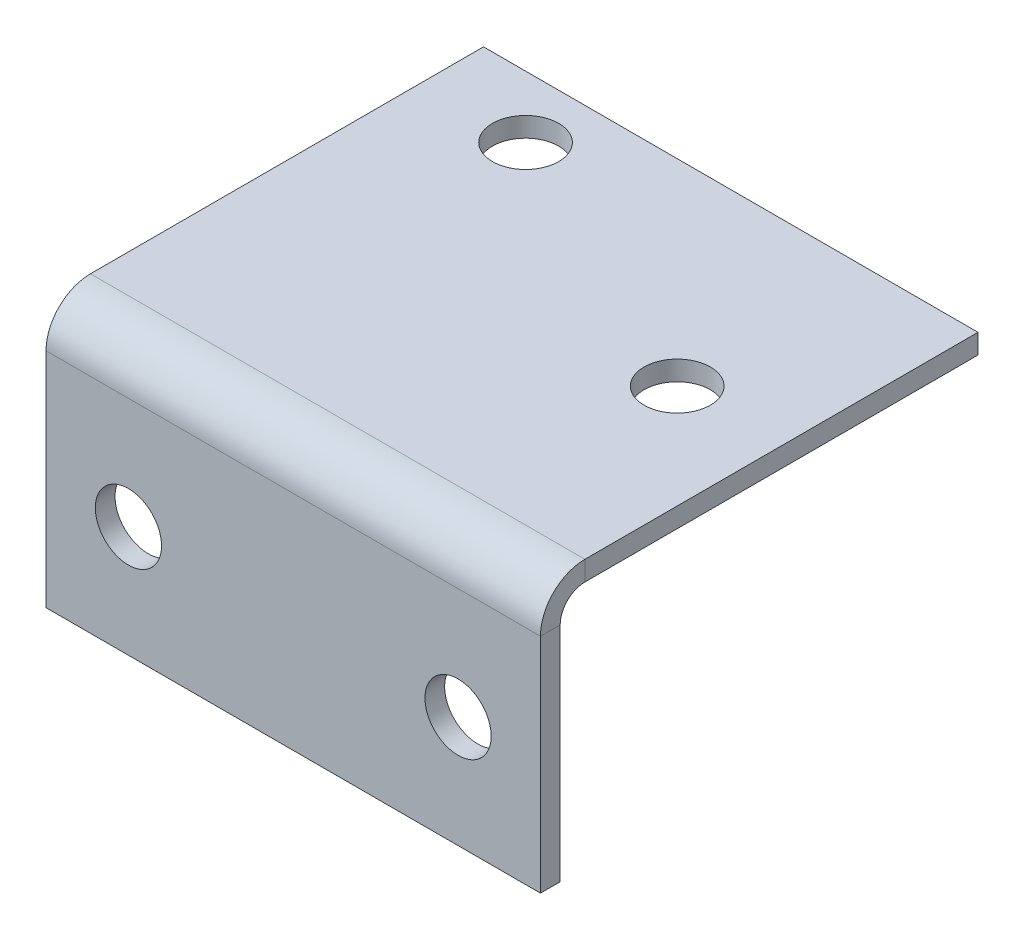
ISO-10303-21;
HEADER;
FILE_DESCRIPTION(('STEP AP214'),'2;1');
FILE_NAME('part.step','',(''),(''),'','','');
FILE_SCHEMA(('AUTOMOTIVE_DESIGN { 1 0 10303 214 1 1 1 1 }'));
ENDSEC;
DATA;
#1=APPLICATION_CONTEXT('core data for automotive mechanical design processes');
#2=APPLICATION_PROTOCOL_DEFINITION('international standard','automotive_design',2000,#1);
#3=PRODUCT_CONTEXT('',#1,'mechanical');
#4=PRODUCT('Part','Part','',(#3));
#5=PRODUCT_RELATED_PRODUCT_CATEGORY('part','',(#4));
#6=PRODUCT_DEFINITION_FORMATION('','',#4);
#7=PRODUCT_DEFINITION_CONTEXT('part definition',#1,'design');
#8=PRODUCT_DEFINITION('design','',#6,#7);
#9=PRODUCT_DEFINITION_SHAPE('','',#8);
#10=(LENGTH_UNIT() NAMED_UNIT(*) SI_UNIT(.MILLI.,.METRE.));
#11=(NAMED_UNIT(*) PLANE_ANGLE_UNIT() SI_UNIT($,.RADIAN.));
#12=(NAMED_UNIT(*) SI_UNIT($,.STERADIAN.) SOLID_ANGLE_UNIT());
#13=UNCERTAINTY_MEASURE_WITH_UNIT(LENGTH_MEASURE(1.E-05),#10,'distance_accuracy_value','');
#14=(GEOMETRIC_REPRESENTATION_CONTEXT(3) GLOBAL_UNCERTAINTY_ASSIGNED_CONTEXT((#13)) GLOBAL_UNIT_ASSIGNED_CONTEXT((#10,
#11,#12)) REPRESENTATION_CONTEXT('',''));
#15=CARTESIAN_POINT('',(0.,0.,0.));
#16=DIRECTION('',(0.,0.,1.));
#17=DIRECTION('',(1.,0.,0.));
#18=AXIS2_PLACEMENT_3D('',#15,#16,#17);
#19=CARTESIAN_POINT('',(19.05,9.52500000000001,-1.51892000000009));
#20=DIRECTION('',(1.,0.,0.));
#21=DIRECTION('',(0.,0.,-1.));
#22=AXIS2_PLACEMENT_3D('',#19,#20,#21);
#23=PLANE('',#22);
#24=DIRECTION('',(0.,1.,0.));
#25=VECTOR('',#24,1.);
#26=CARTESIAN_POINT('',(19.05,9.52500000000001,-1.51892000000009));
#27=LINE('',#26,#25);
#28=CARTESIAN_POINT('',(19.05,-9.525,-1.51892000000009));
#29=VERTEX_POINT('',#28);
#30=CARTESIAN_POINT('',(19.05,7.62000000000002,-1.51892000000009));
#31=VERTEX_POINT('',#30);
#32=EDGE_CURVE('E165',#29,#31,#27,.T.);
#33=ORIENTED_EDGE('',*,*,#32,.T.);
#34=DIRECTION('',(0.,0.,1.));
#35=VECTOR('',#34,1.);
#36=CARTESIAN_POINT('',(19.05,7.62000000000002,-1.51892000000009));
#37=LINE('',#36,#35);
#38=CARTESIAN_POINT('',(19.05,7.62000000000002,0.));
#39=VERTEX_POINT('',#38);
#40=EDGE_CURVE('E150',#31,#39,#37,.T.);
#41=ORIENTED_EDGE('',*,*,#40,.T.);
#42=DIRECTION('',(0.,1.,0.));
#43=VECTOR('',#42,1.);
#44=CARTESIAN_POINT('',(19.05,9.52500000000001,0.));
#45=LINE('',#44,#43);
#46=CARTESIAN_POINT('',(19.05,-9.525,0.));
#47=VERTEX_POINT('',#46);
#48=EDGE_CURVE('E162',#47,#39,#45,.T.);
#49=ORIENTED_EDGE('',*,*,#48,.F.);
#50=DIRECTION('',(0.,0.,1.));
#51=VECTOR('',#50,1.);
#52=CARTESIAN_POINT('',(19.05,-9.525,-1.51892000000009));
#53=LINE('',#52,#51);
#54=EDGE_CURVE('E13',#29,#47,#53,.T.);
#55=ORIENTED_EDGE('',*,*,#54,.F.);
#56=EDGE_LOOP('',(#33,#41,#49,#55));
#57=FACE_BOUND('',#56,.T.);
#58=ADVANCED_FACE('F52',(#57),#23,.T.);
#59=CARTESIAN_POINT('',(0.,0.,-1.51892000000009));
#60=DIRECTION('',(0.,0.,1.));
#61=DIRECTION('',(1.,0.,0.));
#62=AXIS2_PLACEMENT_3D('',#59,#60,#61);
#63=PLANE('',#62);
#64=CARTESIAN_POINT('',(-12.7,-0.952500000000009,-1.51892000000009));
#65=DIRECTION('',(0.,0.,1.));
#66=DIRECTION('',(1.,0.,0.));
#67=AXIS2_PLACEMENT_3D('',#64,#65,#66);
#68=CIRCLE('',#67,2.55269999999999);
#69=CARTESIAN_POINT('',(-10.1473,-0.952500000000009,-1.51892000000009));
#70=VERTEX_POINT('',#69);
#71=EDGE_CURVE('E224',#70,#70,#68,.T.);
#72=ORIENTED_EDGE('',*,*,#71,.T.);
#73=EDGE_LOOP('',(#72));
#74=FACE_BOUND('',#73,.T.);
#75=CARTESIAN_POINT('',(12.7,-0.952499999999995,-1.51892000000009));
#76=DIRECTION('',(0.,0.,1.));
#77=DIRECTION('',(1.,0.,0.));
#78=AXIS2_PLACEMENT_3D('',#75,#76,#77);
#79=CIRCLE('',#78,2.55269999999999);
#80=CARTESIAN_POINT('',(15.2527,-0.952499999999995,-1.51892000000009));
#81=VERTEX_POINT('',#80);
#82=EDGE_CURVE('E217',#81,#81,#79,.T.);
#83=ORIENTED_EDGE('',*,*,#82,.T.);
#84=EDGE_LOOP('',(#83));
#85=FACE_BOUND('',#84,.T.);
#86=DIRECTION('',(1.,0.,0.));
#87=VECTOR('',#86,1.);
#88=CARTESIAN_POINT('',(19.05,7.62000000000002,-1.51892000000009));
#89=LINE('',#88,#87);
#90=CARTESIAN_POINT('',(-19.05,7.62,-1.51892000000009));
#91=VERTEX_POINT('',#90);
#92=EDGE_CURVE('E156',#31,#91,#89,.F.);
#93=ORIENTED_EDGE('',*,*,#92,.F.);
#94=ORIENTED_EDGE('',*,*,#32,.F.);
#95=DIRECTION('',(1.,0.,0.));
#96=VECTOR('',#95,1.);
#97=CARTESIAN_POINT('',(-19.05,-9.52500000000001,-1.51892000000009));
#98=LINE('',#97,#96);
#99=CARTESIAN_POINT('',(-19.05,-9.52500000000001,-1.51892000000009));
#100=VERTEX_POINT('',#99);
#101=EDGE_CURVE('E171',#100,#29,#98,.T.);
#102=ORIENTED_EDGE('',*,*,#101,.F.);
#103=DIRECTION('',(0.,-1.,0.));
#104=VECTOR('',#103,1.);
#105=CARTESIAN_POINT('',(-19.05,9.52499999999999,-1.51892000000009));
#106=LINE('',#105,#104);
#107=EDGE_CURVE('E168',#91,#100,#106,.T.);
#108=ORIENTED_EDGE('',*,*,#107,.F.);
#109=EDGE_LOOP('',(#93,#94,#102,#108));
#110=FACE_BOUND('',#109,.T.);
#111=ADVANCED_FACE('F203',(#74,#85,#110),#63,.F.);
#112=CARTESIAN_POINT('',(0.,0.,0.));
#113=DIRECTION('',(0.,0.,1.));
#114=DIRECTION('',(1.,0.,0.));
#115=AXIS2_PLACEMENT_3D('',#112,#113,#114);
#116=PLANE('',#115);
#117=CARTESIAN_POINT('',(-12.7,-0.952500000000009,0.));
#118=DIRECTION('',(0.,0.,1.));
#119=DIRECTION('',(1.,0.,0.));
#120=AXIS2_PLACEMENT_3D('',#117,#118,#119);
#121=CIRCLE('',#120,2.55269999999999);
#122=CARTESIAN_POINT('',(-10.1473,-0.952500000000009,0.));
#123=VERTEX_POINT('',#122);
#124=EDGE_CURVE('E229',#123,#123,#121,.T.);
#125=ORIENTED_EDGE('',*,*,#124,.F.);
#126=EDGE_LOOP('',(#125));
#127=FACE_BOUND('',#126,.T.);
#128=CARTESIAN_POINT('',(12.7,-0.952499999999995,0.));
#129=DIRECTION('',(0.,0.,1.));
#130=DIRECTION('',(1.,0.,0.));
#131=AXIS2_PLACEMENT_3D('',#128,#129,#130);
#132=CIRCLE('',#131,2.55269999999999);
#133=CARTESIAN_POINT('',(15.2527,-0.952499999999995,0.));
#134=VERTEX_POINT('',#133);
#135=EDGE_CURVE('E220',#134,#134,#132,.T.);
#136=ORIENTED_EDGE('',*,*,#135,.F.);
#137=EDGE_LOOP('',(#136));
#138=FACE_BOUND('',#137,.T.);
#139=ORIENTED_EDGE('',*,*,#48,.T.);
#140=DIRECTION('',(1.,0.,0.));
#141=VECTOR('',#140,1.);
#142=CARTESIAN_POINT('',(19.05,7.62000000000002,0.));
#143=LINE('',#142,#141);
#144=CARTESIAN_POINT('',(-19.05,7.62,0.));
#145=VERTEX_POINT('',#144);
#146=EDGE_CURVE('E145',#39,#145,#143,.F.);
#147=ORIENTED_EDGE('',*,*,#146,.T.);
#148=DIRECTION('',(0.,-1.,0.));
#149=VECTOR('',#148,1.);
#150=CARTESIAN_POINT('',(-19.05,9.52499999999999,0.));
#151=LINE('',#150,#149);
#152=CARTESIAN_POINT('',(-19.05,-9.52500000000001,0.));
#153=VERTEX_POINT('',#152);
#154=EDGE_CURVE('E176',#145,#153,#151,.T.);
#155=ORIENTED_EDGE('',*,*,#154,.T.);
#156=DIRECTION('',(1.,0.,0.));
#157=VECTOR('',#156,1.);
#158=CARTESIAN_POINT('',(-19.05,-9.52500000000001,0.));
#159=LINE('',#158,#157);
#160=EDGE_CURVE('E169',#153,#47,#159,.T.);
#161=ORIENTED_EDGE('',*,*,#160,.T.);
#162=EDGE_LOOP('',(#139,#147,#155,#161));
#163=FACE_BOUND('',#162,.T.);
#164=ADVANCED_FACE('F181',(#127,#138,#163),#116,.T.);
#165=CARTESIAN_POINT('',(-19.05,-9.52500000000001,-1.51892000000009));
#166=DIRECTION('',(0.,-1.,0.));
#167=DIRECTION('',(0.,0.,-1.));
#168=AXIS2_PLACEMENT_3D('',#165,#166,#167);
#169=PLANE('',#168);
#170=ORIENTED_EDGE('',*,*,#160,.F.);
#171=DIRECTION('',(0.,0.,1.));
#172=VECTOR('',#171,1.);
#173=CARTESIAN_POINT('',(-19.05,-9.52500000000001,-1.51892000000009));
#174=LINE('',#173,#172);
#175=EDGE_CURVE('E55',#100,#153,#174,.T.);
#176=ORIENTED_EDGE('',*,*,#175,.F.);
#177=ORIENTED_EDGE('',*,*,#101,.T.);
#178=ORIENTED_EDGE('',*,*,#54,.T.);
#179=EDGE_LOOP('',(#170,#176,#177,#178));
#180=FACE_BOUND('',#179,.T.);
#181=ADVANCED_FACE('F187',(#180),#169,.T.);
#182=CARTESIAN_POINT('',(-19.05,9.52499999999999,-1.51892000000009));
#183=DIRECTION('',(-1.,0.,0.));
#184=DIRECTION('',(0.,-1.,0.));
#185=AXIS2_PLACEMENT_3D('',#182,#183,#184);
#186=PLANE('',#185);
#187=DIRECTION('',(0.,0.,1.));
#188=VECTOR('',#187,1.);
#189=CARTESIAN_POINT('',(-19.05,7.62,-1.51892000000009));
#190=LINE('',#189,#188);
#191=EDGE_CURVE('E160',#91,#145,#190,.T.);
#192=ORIENTED_EDGE('',*,*,#191,.F.);
#193=ORIENTED_EDGE('',*,*,#107,.T.);
#194=ORIENTED_EDGE('',*,*,#175,.T.);
#195=ORIENTED_EDGE('',*,*,#154,.F.);
#196=EDGE_LOOP('',(#192,#193,#194,#195));
#197=FACE_BOUND('',#196,.T.);
#198=ADVANCED_FACE('F206',(#197),#186,.T.);
#199=CARTESIAN_POINT('',(-19.05,7.62,-3.42391999999991));
#200=DIRECTION('',(-1.,0.,0.));
#201=DIRECTION('',(0.,0.,1.));
#202=AXIS2_PLACEMENT_3D('',#199,#200,#201);
#203=PLANE('',#202);
#204=DIRECTION('',(0.,1.,0.));
#205=VECTOR('',#204,1.);
#206=CARTESIAN_POINT('',(-19.05,9.52500000000001,-3.42391999999991));
#207=LINE('',#206,#205);
#208=CARTESIAN_POINT('',(-19.05,9.52500000000001,-3.42391999999991));
#209=VERTEX_POINT('',#208);
#210=CARTESIAN_POINT('',(-19.05,11.04392,-3.42391999999991));
#211=VERTEX_POINT('',#210);
#212=EDGE_CURVE('E214',#209,#211,#207,.T.);
#213=ORIENTED_EDGE('',*,*,#212,.F.);
#214=CARTESIAN_POINT('',(-19.05,7.62,-3.42391999999991));
#215=DIRECTION('',(1.,0.,0.));
#216=DIRECTION('',(0.,0.,-1.));
#217=AXIS2_PLACEMENT_3D('',#214,#215,#216);
#218=CIRCLE('',#217,1.905);
#219=EDGE_CURVE('E153',#91,#209,#218,.F.);
#220=ORIENTED_EDGE('',*,*,#219,.F.);
#221=ORIENTED_EDGE('',*,*,#191,.T.);
#222=CARTESIAN_POINT('',(-19.05,7.62,-3.42391999999991));
#223=DIRECTION('',(1.,0.,0.));
#224=DIRECTION('',(0.,0.,-1.));
#225=AXIS2_PLACEMENT_3D('',#222,#223,#224);
#226=CIRCLE('',#225,3.42392);
#227=EDGE_CURVE('E74',#145,#211,#226,.F.);
#228=ORIENTED_EDGE('',*,*,#227,.T.);
#229=EDGE_LOOP('',(#213,#220,#221,#228));
#230=FACE_BOUND('',#229,.T.);
#231=ADVANCED_FACE('F209',(#230),#203,.T.);
#232=CARTESIAN_POINT('',(19.05,7.62000000000002,-3.42391999999991));
#233=DIRECTION('',(-1.,0.,0.));
#234=DIRECTION('',(0.,0.,1.));
#235=AXIS2_PLACEMENT_3D('',#232,#233,#234);
#236=PLANE('',#235);
#237=CARTESIAN_POINT('',(19.05,7.62000000000002,-3.42391999999991));
#238=DIRECTION('',(1.,0.,0.));
#239=DIRECTION('',(0.,0.,-1.));
#240=AXIS2_PLACEMENT_3D('',#237,#238,#239);
#241=CIRCLE('',#240,1.905);
#242=CARTESIAN_POINT('',(19.05,9.52500000000001,-3.42391999999991));
#243=VERTEX_POINT('',#242);
#244=EDGE_CURVE('E138',#243,#31,#241,.T.);
#245=ORIENTED_EDGE('',*,*,#244,.F.);
#246=DIRECTION('',(0.,1.,0.));
#247=VECTOR('',#246,1.);
#248=CARTESIAN_POINT('',(19.05,9.52500000000001,-3.42391999999991));
#249=LINE('',#248,#247);
#250=CARTESIAN_POINT('',(19.05,11.04392,-3.42391999999991));
#251=VERTEX_POINT('',#250);
#252=EDGE_CURVE('E212',#243,#251,#249,.T.);
#253=ORIENTED_EDGE('',*,*,#252,.T.);
#254=CARTESIAN_POINT('',(19.05,7.62000000000002,-3.42391999999991));
#255=DIRECTION('',(1.,0.,0.));
#256=DIRECTION('',(0.,0.,-1.));
#257=AXIS2_PLACEMENT_3D('',#254,#255,#256);
#258=CIRCLE('',#257,3.42392);
#259=EDGE_CURVE('E148',#251,#39,#258,.T.);
#260=ORIENTED_EDGE('',*,*,#259,.T.);
#261=ORIENTED_EDGE('',*,*,#40,.F.);
#262=EDGE_LOOP('',(#245,#253,#260,#261));
#263=FACE_BOUND('',#262,.T.);
#264=ADVANCED_FACE('F193',(#263),#236,.F.);
#265=CARTESIAN_POINT('',(19.05,7.62000000000002,-3.42391999999991));
#266=DIRECTION('',(1.,0.,0.));
#267=DIRECTION('',(0.,1.,0.));
#268=AXIS2_PLACEMENT_3D('',#265,#266,#267);
#269=CYLINDRICAL_SURFACE('',#268,3.42392);
#270=ORIENTED_EDGE('',*,*,#146,.F.);
#271=ORIENTED_EDGE('',*,*,#259,.F.);
#272=DIRECTION('',(-1.,0.,0.));
#273=VECTOR('',#272,1.);
#274=CARTESIAN_POINT('',(0.,11.04392,-3.42391999999991));
#275=LINE('',#274,#273);
#276=EDGE_CURVE('E134',#251,#211,#275,.T.);
#277=ORIENTED_EDGE('',*,*,#276,.T.);
#278=ORIENTED_EDGE('',*,*,#227,.F.);
#279=EDGE_LOOP('',(#270,#271,#277,#278));
#280=FACE_BOUND('',#279,.T.);
#281=ADVANCED_FACE('F211',(#280),#269,.T.);
#282=CARTESIAN_POINT('',(19.05,7.62000000000002,-3.42391999999991));
#283=DIRECTION('',(1.,0.,0.));
#284=DIRECTION('',(0.,1.,0.));
#285=AXIS2_PLACEMENT_3D('',#282,#283,#284);
#286=CYLINDRICAL_SURFACE('',#285,1.905);
#287=ORIENTED_EDGE('',*,*,#92,.T.);
#288=ORIENTED_EDGE('',*,*,#219,.T.);
#289=DIRECTION('',(1.,0.,0.));
#290=VECTOR('',#289,1.);
#291=CARTESIAN_POINT('',(-19.05,9.52500000000001,-3.42391999999991));
#292=LINE('',#291,#290);
#293=EDGE_CURVE('E200',#209,#243,#292,.T.);
#294=ORIENTED_EDGE('',*,*,#293,.T.);
#295=ORIENTED_EDGE('',*,*,#244,.T.);
#296=EDGE_LOOP('',(#287,#288,#294,#295));
#297=FACE_BOUND('',#296,.T.);
#298=ADVANCED_FACE('F197',(#297),#286,.F.);
#299=CARTESIAN_POINT('',(19.05,11.0439200000002,-45.96892));
#300=DIRECTION('',(-1.,0.,0.));
#301=DIRECTION('',(0.,0.,1.));
#302=AXIS2_PLACEMENT_3D('',#299,#300,#301);
#303=PLANE('',#302);
#304=DIRECTION('',(0.,0.,-1.));
#305=VECTOR('',#304,1.);
#306=CARTESIAN_POINT('',(19.05,9.52500000000016,-45.96892));
#307=LINE('',#306,#305);
#308=CARTESIAN_POINT('',(19.05,9.52500000000012,-33.71342));
#309=VERTEX_POINT('',#308);
#310=EDGE_CURVE('E130',#243,#309,#307,.T.);
#311=ORIENTED_EDGE('',*,*,#310,.T.);
#312=DIRECTION('',(0.,-1.,0.));
#313=VECTOR('',#312,1.);
#314=CARTESIAN_POINT('',(19.05,11.0439200000003,-33.71342));
#315=LINE('',#314,#313);
#316=CARTESIAN_POINT('',(19.05,11.0439200000003,-33.71342));
#317=VERTEX_POINT('',#316);
#318=EDGE_CURVE('E66',#317,#309,#315,.T.);
#319=ORIENTED_EDGE('',*,*,#318,.F.);
#320=DIRECTION('',(0.,0.,-1.));
#321=VECTOR('',#320,1.);
#322=CARTESIAN_POINT('',(19.05,11.0439200000002,-45.96892));
#323=LINE('',#322,#321);
#324=EDGE_CURVE('E128',#251,#317,#323,.T.);
#325=ORIENTED_EDGE('',*,*,#324,.F.);
#326=ORIENTED_EDGE('',*,*,#252,.F.);
#327=EDGE_LOOP('',(#311,#319,#325,#326));
#328=FACE_BOUND('',#327,.T.);
#329=ADVANCED_FACE('F126',(#328),#303,.F.);
#330=CARTESIAN_POINT('',(-19.05,11.04392,-1.51892000000009));
#331=DIRECTION('',(1.,0.,0.));
#332=DIRECTION('',(0.,0.,-1.));
#333=AXIS2_PLACEMENT_3D('',#330,#331,#332);
#334=PLANE('',#333);
#335=DIRECTION('',(0.,0.,1.));
#336=VECTOR('',#335,1.);
#337=CARTESIAN_POINT('',(-19.05,11.04392,-1.51892000000009));
#338=LINE('',#337,#336);
#339=CARTESIAN_POINT('',(-19.05,11.0439200000003,-33.71342));
#340=VERTEX_POINT('',#339);
#341=EDGE_CURVE('E135',#340,#211,#338,.T.);
#342=ORIENTED_EDGE('',*,*,#341,.F.);
#343=DIRECTION('',(0.,-1.,0.));
#344=VECTOR('',#343,1.);
#345=CARTESIAN_POINT('',(-19.05,11.0439200000003,-33.71342));
#346=LINE('',#345,#344);
#347=CARTESIAN_POINT('',(-19.05,9.52500000000012,-33.71342));
#348=VERTEX_POINT('',#347);
#349=EDGE_CURVE('E117',#340,#348,#346,.T.);
#350=ORIENTED_EDGE('',*,*,#349,.T.);
#351=DIRECTION('',(0.,0.,1.));
#352=VECTOR('',#351,1.);
#353=CARTESIAN_POINT('',(-19.05,9.52499999999999,-1.51892000000009));
#354=LINE('',#353,#352);
#355=EDGE_CURVE('E136',#348,#209,#354,.T.);
#356=ORIENTED_EDGE('',*,*,#355,.T.);
#357=ORIENTED_EDGE('',*,*,#212,.T.);
#358=EDGE_LOOP('',(#342,#350,#356,#357));
#359=FACE_BOUND('',#358,.T.);
#360=ADVANCED_FACE('F247',(#359),#334,.F.);
#361=CARTESIAN_POINT('',(0.,11.04392,0.));
#362=DIRECTION('',(0.,-1.,0.));
#363=DIRECTION('',(0.,0.,-1.));
#364=AXIS2_PLACEMENT_3D('',#361,#362,#363);
#365=PLANE('',#364);
#366=CARTESIAN_POINT('',(11.049,11.0439200000001,-18.5369200000001));
#367=DIRECTION('',(0.,-1.,0.));
#368=DIRECTION('',(0.,0.,-1.));
#369=AXIS2_PLACEMENT_3D('',#366,#367,#368);
#370=CIRCLE('',#369,2.55269999999999);
#371=CARTESIAN_POINT('',(11.049,11.0439200000001,-21.0896200000001));
#372=VERTEX_POINT('',#371);
#373=EDGE_CURVE('E238',#372,#372,#370,.T.);
#374=ORIENTED_EDGE('',*,*,#373,.T.);
#375=EDGE_LOOP('',(#374));
#376=FACE_BOUND('',#375,.T.);
#377=CARTESIAN_POINT('',(-11.049,11.0439200000001,-28.95092));
#378=DIRECTION('',(0.,-1.,0.));
#379=DIRECTION('',(0.,0.,-1.));
#380=AXIS2_PLACEMENT_3D('',#377,#378,#379);
#381=CIRCLE('',#380,2.55269999999999);
#382=CARTESIAN_POINT('',(-11.049,11.0439200000001,-31.50362));
#383=VERTEX_POINT('',#382);
#384=EDGE_CURVE('E232',#383,#383,#381,.T.);
#385=ORIENTED_EDGE('',*,*,#384,.T.);
#386=EDGE_LOOP('',(#385));
#387=FACE_BOUND('',#386,.T.);
#388=ORIENTED_EDGE('',*,*,#324,.T.);
#389=DIRECTION('',(-1.,0.,0.));
#390=VECTOR('',#389,1.);
#391=CARTESIAN_POINT('',(-19.05,11.0439200000003,-33.71342));
#392=LINE('',#391,#390);
#393=EDGE_CURVE('E114',#317,#340,#392,.T.);
#394=ORIENTED_EDGE('',*,*,#393,.T.);
#395=ORIENTED_EDGE('',*,*,#341,.T.);
#396=ORIENTED_EDGE('',*,*,#276,.F.);
#397=EDGE_LOOP('',(#388,#394,#395,#396));
#398=FACE_BOUND('',#397,.T.);
#399=ADVANCED_FACE('F133',(#376,#387,#398),#365,.F.);
#400=CARTESIAN_POINT('',(0.,9.52499999999999,0.));
#401=DIRECTION('',(0.,-1.,0.));
#402=DIRECTION('',(0.,0.,-1.));
#403=AXIS2_PLACEMENT_3D('',#400,#401,#402);
#404=PLANE('',#403);
#405=DIRECTION('',(-1.,0.,0.));
#406=VECTOR('',#405,1.);
#407=CARTESIAN_POINT('',(-19.05,9.52500000000012,-33.71342));
#408=LINE('',#407,#406);
#409=EDGE_CURVE('E121',#309,#348,#408,.T.);
#410=ORIENTED_EDGE('',*,*,#409,.F.);
#411=ORIENTED_EDGE('',*,*,#310,.F.);
#412=ORIENTED_EDGE('',*,*,#293,.F.);
#413=ORIENTED_EDGE('',*,*,#355,.F.);
#414=EDGE_LOOP('',(#410,#411,#412,#413));
#415=FACE_BOUND('',#414,.T.);
#416=CARTESIAN_POINT('',(11.049,9.52500000000006,-18.5369200000001));
#417=DIRECTION('',(0.,-1.,0.));
#418=DIRECTION('',(0.,0.,-1.));
#419=AXIS2_PLACEMENT_3D('',#416,#417,#418);
#420=CIRCLE('',#419,2.55269999999999);
#421=CARTESIAN_POINT('',(11.049,9.52500000000006,-21.0896200000001));
#422=VERTEX_POINT('',#421);
#423=EDGE_CURVE('E241',#422,#422,#420,.T.);
#424=ORIENTED_EDGE('',*,*,#423,.F.);
#425=EDGE_LOOP('',(#424));
#426=FACE_BOUND('',#425,.T.);
#427=CARTESIAN_POINT('',(-11.049,9.5250000000001,-28.95092));
#428=DIRECTION('',(0.,-1.,0.));
#429=DIRECTION('',(0.,0.,-1.));
#430=AXIS2_PLACEMENT_3D('',#427,#428,#429);
#431=CIRCLE('',#430,2.55269999999999);
#432=CARTESIAN_POINT('',(-11.049,9.5250000000001,-31.50362));
#433=VERTEX_POINT('',#432);
#434=EDGE_CURVE('E235',#433,#433,#431,.T.);
#435=ORIENTED_EDGE('',*,*,#434,.F.);
#436=EDGE_LOOP('',(#435));
#437=FACE_BOUND('',#436,.T.);
#438=ADVANCED_FACE('F248',(#415,#426,#437),#404,.T.);
#439=CARTESIAN_POINT('',(12.7,-0.952499999999995,0.));
#440=DIRECTION('',(0.,0.,1.));
#441=DIRECTION('',(1.,0.,0.));
#442=AXIS2_PLACEMENT_3D('',#439,#440,#441);
#443=CYLINDRICAL_SURFACE('',#442,2.55269999999999);
#444=ORIENTED_EDGE('',*,*,#82,.F.);
#445=EDGE_LOOP('',(#444));
#446=FACE_BOUND('',#445,.T.);
#447=ORIENTED_EDGE('',*,*,#135,.T.);
#448=EDGE_LOOP('',(#447));
#449=FACE_BOUND('',#448,.T.);
#450=ADVANCED_FACE('F251',(#446,#449),#443,.F.);
#451=CARTESIAN_POINT('',(-12.7,-0.952500000000009,0.));
#452=DIRECTION('',(0.,0.,1.));
#453=DIRECTION('',(1.,0.,0.));
#454=AXIS2_PLACEMENT_3D('',#451,#452,#453);
#455=CYLINDRICAL_SURFACE('',#454,2.55269999999999);
#456=ORIENTED_EDGE('',*,*,#71,.F.);
#457=EDGE_LOOP('',(#456));
#458=FACE_BOUND('',#457,.T.);
#459=ORIENTED_EDGE('',*,*,#124,.T.);
#460=EDGE_LOOP('',(#459));
#461=FACE_BOUND('',#460,.T.);
#462=ADVANCED_FACE('F260',(#458,#461),#455,.F.);
#463=CARTESIAN_POINT('',(-11.049,9.5250000000001,-28.95092));
#464=DIRECTION('',(0.,-1.,0.));
#465=DIRECTION('',(0.,0.,-1.));
#466=AXIS2_PLACEMENT_3D('',#463,#464,#465);
#467=CYLINDRICAL_SURFACE('',#466,2.55269999999999);
#468=ORIENTED_EDGE('',*,*,#384,.F.);
#469=EDGE_LOOP('',(#468));
#470=FACE_BOUND('',#469,.T.);
#471=ORIENTED_EDGE('',*,*,#434,.T.);
#472=EDGE_LOOP('',(#471));
#473=FACE_BOUND('',#472,.T.);
#474=ADVANCED_FACE('F257',(#470,#473),#467,.F.);
#475=CARTESIAN_POINT('',(11.049,9.52500000000006,-18.5369200000001));
#476=DIRECTION('',(0.,-1.,0.));
#477=DIRECTION('',(0.,0.,-1.));
#478=AXIS2_PLACEMENT_3D('',#475,#476,#477);
#479=CYLINDRICAL_SURFACE('',#478,2.55269999999999);
#480=ORIENTED_EDGE('',*,*,#373,.F.);
#481=EDGE_LOOP('',(#480));
#482=FACE_BOUND('',#481,.T.);
#483=ORIENTED_EDGE('',*,*,#423,.T.);
#484=EDGE_LOOP('',(#483));
#485=FACE_BOUND('',#484,.T.);
#486=ADVANCED_FACE('F259',(#482,#485),#479,.F.);
#487=CARTESIAN_POINT('',(-19.05,11.0439200000003,-33.71342));
#488=DIRECTION('',(0.,0.,1.));
#489=DIRECTION('',(0.,-1.,0.));
#490=AXIS2_PLACEMENT_3D('',#487,#488,#489);
#491=PLANE('',#490);
#492=ORIENTED_EDGE('',*,*,#409,.T.);
#493=ORIENTED_EDGE('',*,*,#349,.F.);
#494=ORIENTED_EDGE('',*,*,#393,.F.);
#495=ORIENTED_EDGE('',*,*,#318,.T.);
#496=EDGE_LOOP('',(#492,#493,#494,#495));
#497=FACE_BOUND('',#496,.T.);
#498=ADVANCED_FACE('F115',(#497),#491,.F.);
#499=CLOSED_SHELL('',(#58,#111,#164,#181,#198,#231,#264,#281,#298,#329,#360,#399,#438,#450,#462,
#474,#486,#498));
#500=MANIFOLD_SOLID_BREP('B2',#499);
#501=ADVANCED_BREP_SHAPE_REPRESENTATION('',(#18,#500),#14);
#502=SHAPE_DEFINITION_REPRESENTATION(#9,#501);
ENDSEC;
END-ISO-10303-21;
